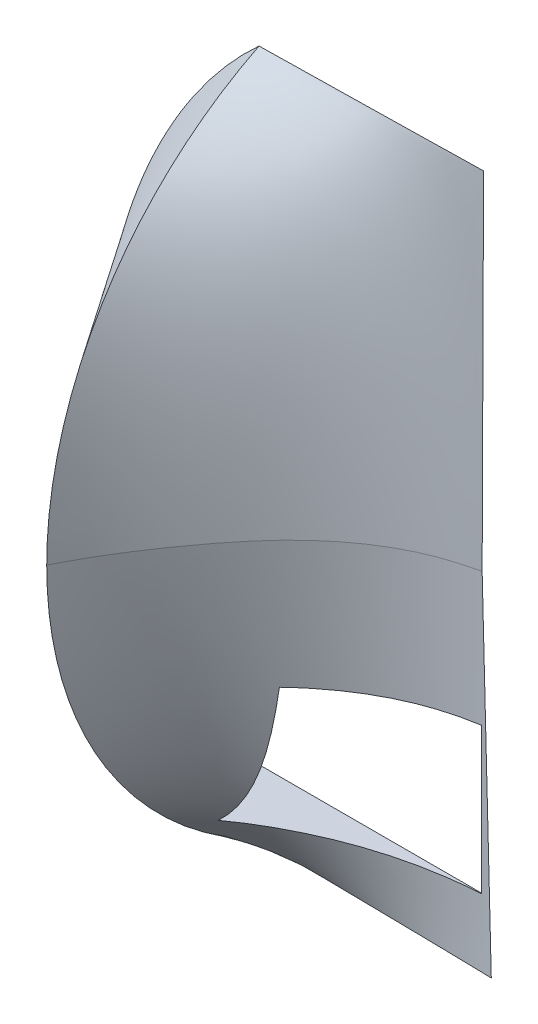
ISO-10303-21;
HEADER;
FILE_DESCRIPTION(('STEP AP214'),'2;1');
FILE_NAME('part.step','',(''),(''),'','','');
FILE_SCHEMA(('AUTOMOTIVE_DESIGN { 1 0 10303 214 1 1 1 1 }'));
ENDSEC;
DATA;
#1=APPLICATION_CONTEXT('core data for automotive mechanical design processes');
#2=APPLICATION_PROTOCOL_DEFINITION('international standard','automotive_design',2000,#1);
#3=PRODUCT_CONTEXT('',#1,'mechanical');
#4=PRODUCT('Part','Part','',(#3));
#5=PRODUCT_RELATED_PRODUCT_CATEGORY('part','',(#4));
#6=PRODUCT_DEFINITION_FORMATION('','',#4);
#7=PRODUCT_DEFINITION_CONTEXT('part definition',#1,'design');
#8=PRODUCT_DEFINITION('design','',#6,#7);
#9=PRODUCT_DEFINITION_SHAPE('','',#8);
#10=(LENGTH_UNIT() NAMED_UNIT(*) SI_UNIT(.MILLI.,.METRE.));
#11=(NAMED_UNIT(*) PLANE_ANGLE_UNIT() SI_UNIT($,.RADIAN.));
#12=(NAMED_UNIT(*) SI_UNIT($,.STERADIAN.) SOLID_ANGLE_UNIT());
#13=UNCERTAINTY_MEASURE_WITH_UNIT(LENGTH_MEASURE(1.E-05),#10,'distance_accuracy_value','');
#14=(GEOMETRIC_REPRESENTATION_CONTEXT(3) GLOBAL_UNCERTAINTY_ASSIGNED_CONTEXT((#13)) GLOBAL_UNIT_ASSIGNED_CONTEXT((#10,
#11,#12)) REPRESENTATION_CONTEXT('',''));
#15=CARTESIAN_POINT('',(0.,0.,0.));
#16=DIRECTION('',(0.,0.,1.));
#17=DIRECTION('',(1.,0.,0.));
#18=AXIS2_PLACEMENT_3D('',#15,#16,#17);
#19=CARTESIAN_POINT('',(-7.0169426798972,164.309273303935,-23.639993355338));
#20=DIRECTION('',(-1.,0.,0.));
#21=DIRECTION('',(0.,-1.,0.));
#22=AXIS2_PLACEMENT_3D('',#19,#20,#21);
#23=CIRCLE('',#22,22.3714261491486);
#24=DIRECTION('',(0.590839697824268,0.140305600523294,0.794495305169719));
#25=VECTOR('',#24,1.);
#26=SURFACE_OF_LINEAR_EXTRUSION('',#23,#25);
#27=CARTESIAN_POINT('',(18.,190.262014090211,20.));
#28=CARTESIAN_POINT('',(17.7579578460864,190.041886930324,20.));
#29=CARTESIAN_POINT('',(17.5208670592247,189.816363579263,20.));
#30=CARTESIAN_POINT('',(17.0565925500612,189.355427255375,20.));
#31=CARTESIAN_POINT('',(16.8294067973651,189.120016328974,20.));
#32=CARTESIAN_POINT('',(16.3850835924438,188.640371612688,20.));
#33=CARTESIAN_POINT('',(16.1679357032237,188.396147479567,20.));
#34=CARTESIAN_POINT('',(15.7433638030594,187.899387411779,20.));
#35=CARTESIAN_POINT('',(15.5359404313314,187.646850932573,20.));
#36=CARTESIAN_POINT('',(14.9285144647548,186.878268183608,20.));
#37=CARTESIAN_POINT('',(14.5429011242624,186.350754331616,20.));
#38=CARTESIAN_POINT('',(13.8095645558032,185.269948073454,20.));
#39=CARTESIAN_POINT('',(13.4618531474176,184.716647702203,20.));
#40=CARTESIAN_POINT('',(12.804131055731,183.588713666381,20.));
#41=CARTESIAN_POINT('',(12.4940897753426,183.014097817016,20.));
#42=CARTESIAN_POINT('',(11.9109937855409,181.846394301616,20.));
#43=CARTESIAN_POINT('',(11.6379414521499,181.253305451956,20.));
#44=CARTESIAN_POINT('',(11.1287421225466,180.051738543957,20.));
#45=CARTESIAN_POINT('',(10.8925832895889,179.44326549451,20.));
#46=CARTESIAN_POINT('',(10.457118167544,178.213305578093,20.));
#47=CARTESIAN_POINT('',(10.2578109368784,177.591819044076,20.));
#48=CARTESIAN_POINT('',(9.89636288856868,176.338231724245,20.));
#49=CARTESIAN_POINT('',(9.73421632663307,175.70613259516,20.));
#50=CARTESIAN_POINT('',(9.44759871395448,174.433351280502,20.));
#51=CARTESIAN_POINT('',(9.32313452606818,173.792667553631,20.));
#52=CARTESIAN_POINT('',(9.08073672715209,172.308904515552,20.));
#53=CARTESIAN_POINT('',(8.97632192378528,171.463577064794,20.));
#54=CARTESIAN_POINT('',(8.83584583289237,169.767230596266,20.));
#55=CARTESIAN_POINT('',(8.79977969381085,168.916211986773,20.));
#56=CARTESIAN_POINT('',(8.79978448087299,167.41238777615,20.));
#57=CARTESIAN_POINT('',(8.82101582777535,166.759562378267,20.));
#58=CARTESIAN_POINT('',(8.90812461957761,165.45688036515,20.));
#59=CARTESIAN_POINT('',(8.97399718461456,164.807023433241,20.));
#60=CARTESIAN_POINT('',(9.15308603647443,163.513155072062,20.));
#61=CARTESIAN_POINT('',(9.26634829179266,162.869149940498,20.));
#62=CARTESIAN_POINT('',(9.54331153874616,161.591960654778,20.));
#63=CARTESIAN_POINT('',(9.70701005629492,160.958775971446,20.));
#64=CARTESIAN_POINT('',(10.0632917648379,159.790831285893,20.));
#65=CARTESIAN_POINT('',(10.2492657824912,159.254058845098,20.));
#66=CARTESIAN_POINT('',(10.6643705761642,158.197438089685,20.));
#67=CARTESIAN_POINT('',(10.8934910835431,157.677585782619,20.));
#68=CARTESIAN_POINT('',(11.3564285459393,156.743022393248,20.));
#69=CARTESIAN_POINT('',(11.5834436291234,156.324943937405,20.));
#70=CARTESIAN_POINT('',(12.0708018016585,155.508619252455,20.));
#71=CARTESIAN_POINT('',(12.3311409797001,155.110370703485,20.));
#72=CARTESIAN_POINT('',(12.8472825870951,154.392518202587,20.));
#73=CARTESIAN_POINT('',(13.0986131784487,154.06971176386,20.));
#74=CARTESIAN_POINT('',(13.4947180576225,153.601901235782,20.));
#75=CARTESIAN_POINT('',(13.6299108006218,153.448724675588,20.));
#76=CARTESIAN_POINT('',(13.9067224848923,153.148215223779,20.));
#77=CARTESIAN_POINT('',(14.0483431556291,153.000883925084,20.));
#78=CARTESIAN_POINT('',(14.4663114310243,152.584810334125,20.));
#79=CARTESIAN_POINT('',(14.7508326185575,152.324179802817,20.));
#80=CARTESIAN_POINT('',(15.3418720232683,151.828995968898,20.));
#81=CARTESIAN_POINT('',(15.6483919450039,151.594444690619,20.));
#82=CARTESIAN_POINT('',(16.1248846114703,151.263886511147,20.));
#83=CARTESIAN_POINT('',(16.2872644814334,151.156815237988,20.));
#84=CARTESIAN_POINT('',(16.6170046677287,150.950614544805,20.));
#85=CARTESIAN_POINT('',(16.7843648688276,150.851484941226,20.));
#86=CARTESIAN_POINT('',(17.1239234189894,150.661495867161,20.));
#87=CARTESIAN_POINT('',(17.2961261781209,150.570644277056,20.));
#88=CARTESIAN_POINT('',(17.6448886184522,150.397671278094,20.));
#89=CARTESIAN_POINT('',(17.8214488716706,150.315551023012,20.));
#90=CARTESIAN_POINT('',(17.9999999999667,150.237985909804,20.));
#91=B_SPLINE_CURVE_WITH_KNOTS('',3,(#27,#28,#29,#30,#31,#32,#33,#34,#35,#36,#37,#38,#39,#40,#41,
#42,#43,#44,#45,#46,#47,#48,#49,#50,#51,#52,#53,#54,#55,#56,#57,#58,#59,#60,#61,#62,#63,#64,#65,
#66,#67,#68,#69,#70,#71,#72,#73,#74,#75,#76,#77,#78,#79,#80,#81,#82,#83,#84,#85,#86,#87,#88,#89,
#90),.UNSPECIFIED.,.F.,.F.,(4,2,2,2,2,2,2,2,2,2,2,2,2,2,2,2,2,2,2,2,2,2,2,2,2,2,2,2,2,2,2,4),
(0.,0.981380587919026,1.96255905143303,2.9426932538982,3.92289179290148,5.88127894360083,
7.84027507357073,9.79766924293357,11.7551890879249,13.7120795954659,15.6689200964836,
17.6254579050119,19.5823518315595,22.1348797603662,24.6872264977078,26.6453543942538,
28.6032682765956,30.5630857750927,32.5228071525445,34.2253669973386,35.9275221526508,
37.3533247865063,38.7789602245089,40.0049163165518,40.6176653866214,41.2305803086301,
42.3866581674218,43.5428257010903,44.1261457360998,44.7094522849381,45.2933084430373,
45.8772416573557),.UNSPECIFIED.);
#92=CARTESIAN_POINT('',(18.,150.237985909812,20.0000000000447));
#93=VERTEX_POINT('',#92);
#94=CARTESIAN_POINT('',(13.1619546469406,154.,20.));
#95=VERTEX_POINT('',#94);
#96=EDGE_CURVE('E106',#93,#95,#91,.F.);
#97=ORIENTED_EDGE('',*,*,#96,.F.);
#98=CARTESIAN_POINT('',(18.,170.25,32.3714261491486));
#99=CARTESIAN_POINT('',(18.,164.368180059982,32.3714261491486));
#100=CARTESIAN_POINT('',(18.,157.713911716258,30.2783714946459));
#101=CARTESIAN_POINT('',(18.,152.867152195783,25.2614912760521));
#102=CARTESIAN_POINT('',(18.,150.237985909811,20.0000000000447));
#103=(BOUNDED_CURVE() B_SPLINE_CURVE(4,(#98,#99,#100,#101,#102),.UNSPECIFIED.,.F.,
.F.) B_SPLINE_CURVE_WITH_KNOTS((5,5),(0.,1.),
.UNSPECIFIED.) CURVE() GEOMETRIC_REPRESENTATION_ITEM() RATIONAL_B_SPLINE_CURVE((0.540368887033077,
0.540368887033077,0.532326741111923,0.540368887033077,0.540368887033077)) REPRESENTATION_ITEM(''));
#104=CARTESIAN_POINT('',(18.,170.25,32.3714261491486));
#105=VERTEX_POINT('',#104);
#106=EDGE_CURVE('E311',#105,#93,#103,.T.);
#107=ORIENTED_EDGE('',*,*,#106,.F.);
#108=CARTESIAN_POINT('',(18.,190.262014090189,20.0000000000448));
#109=CARTESIAN_POINT('',(18.,187.632847804217,25.2614912760521));
#110=CARTESIAN_POINT('',(18.,182.786088283742,30.2783714946459));
#111=CARTESIAN_POINT('',(18.,176.131819940018,32.3714261491486));
#112=CARTESIAN_POINT('',(18.,170.25,32.3714261491486));
#113=(BOUNDED_CURVE() B_SPLINE_CURVE(4,(#108,#109,#110,#111,#112),.UNSPECIFIED.,.F.,
.F.) B_SPLINE_CURVE_WITH_KNOTS((5,5),(0.,1.),
.UNSPECIFIED.) CURVE() GEOMETRIC_REPRESENTATION_ITEM() RATIONAL_B_SPLINE_CURVE((0.540368887033077,
0.540368887033077,0.532326741111923,0.540368887033077,0.540368887033077)) REPRESENTATION_ITEM(''));
#114=CARTESIAN_POINT('',(18.,190.262014090189,20.0000000000447));
#115=VERTEX_POINT('',#114);
#116=EDGE_CURVE('E260',#115,#105,#113,.T.);
#117=ORIENTED_EDGE('',*,*,#116,.F.);
#118=CARTESIAN_POINT('',(18.,190.262014090211,20.));
#119=CARTESIAN_POINT('',(17.7579578460864,190.041886930324,20.));
#120=CARTESIAN_POINT('',(17.5208670592247,189.816363579263,20.));
#121=CARTESIAN_POINT('',(17.0565925500612,189.355427255375,20.));
#122=CARTESIAN_POINT('',(16.8294067973651,189.120016328974,20.));
#123=CARTESIAN_POINT('',(16.3850835924438,188.640371612688,20.));
#124=CARTESIAN_POINT('',(16.1679357032237,188.396147479567,20.));
#125=CARTESIAN_POINT('',(15.7433638030594,187.899387411779,20.));
#126=CARTESIAN_POINT('',(15.5359404313314,187.646850932573,20.));
#127=CARTESIAN_POINT('',(14.9285144647548,186.878268183608,20.));
#128=CARTESIAN_POINT('',(14.5429011242624,186.350754331616,20.));
#129=CARTESIAN_POINT('',(13.8095645558032,185.269948073454,20.));
#130=CARTESIAN_POINT('',(13.4618531474176,184.716647702203,20.));
#131=CARTESIAN_POINT('',(12.804131055731,183.588713666381,20.));
#132=CARTESIAN_POINT('',(12.4940897753426,183.014097817016,20.));
#133=CARTESIAN_POINT('',(11.9109937855409,181.846394301616,20.));
#134=CARTESIAN_POINT('',(11.6379414521499,181.253305451956,20.));
#135=CARTESIAN_POINT('',(11.1287421225466,180.051738543957,20.));
#136=CARTESIAN_POINT('',(10.8925832895889,179.44326549451,20.));
#137=CARTESIAN_POINT('',(10.457118167544,178.213305578093,20.));
#138=CARTESIAN_POINT('',(10.2578109368784,177.591819044076,20.));
#139=CARTESIAN_POINT('',(9.89636288856868,176.338231724245,20.));
#140=CARTESIAN_POINT('',(9.73421632663307,175.70613259516,20.));
#141=CARTESIAN_POINT('',(9.44759871395448,174.433351280502,20.));
#142=CARTESIAN_POINT('',(9.32313452606818,173.792667553631,20.));
#143=CARTESIAN_POINT('',(9.08073672715209,172.308904515552,20.));
#144=CARTESIAN_POINT('',(8.97632192378528,171.463577064794,20.));
#145=CARTESIAN_POINT('',(8.83584583289237,169.767230596266,20.));
#146=CARTESIAN_POINT('',(8.79977969381085,168.916211986773,20.));
#147=CARTESIAN_POINT('',(8.79978448087299,167.41238777615,20.));
#148=CARTESIAN_POINT('',(8.82101582777535,166.759562378267,20.));
#149=CARTESIAN_POINT('',(8.90812461957761,165.45688036515,20.));
#150=CARTESIAN_POINT('',(8.97399718461456,164.807023433241,20.));
#151=CARTESIAN_POINT('',(9.15308603647443,163.513155072062,20.));
#152=CARTESIAN_POINT('',(9.26634829179266,162.869149940498,20.));
#153=CARTESIAN_POINT('',(9.54331153874616,161.591960654778,20.));
#154=CARTESIAN_POINT('',(9.70701005629492,160.958775971446,20.));
#155=CARTESIAN_POINT('',(10.0632917648379,159.790831285893,20.));
#156=CARTESIAN_POINT('',(10.2492657824912,159.254058845098,20.));
#157=CARTESIAN_POINT('',(10.6643705761642,158.197438089685,20.));
#158=CARTESIAN_POINT('',(10.8934910835431,157.677585782619,20.));
#159=CARTESIAN_POINT('',(11.3564285459393,156.743022393248,20.));
#160=CARTESIAN_POINT('',(11.5834436291234,156.324943937405,20.));
#161=CARTESIAN_POINT('',(12.0708018016585,155.508619252455,20.));
#162=CARTESIAN_POINT('',(12.3311409797001,155.110370703485,20.));
#163=CARTESIAN_POINT('',(12.8472825870951,154.392518202587,20.));
#164=CARTESIAN_POINT('',(13.0986131784487,154.06971176386,20.));
#165=CARTESIAN_POINT('',(13.4947180576225,153.601901235782,20.));
#166=CARTESIAN_POINT('',(13.6299108006218,153.448724675588,20.));
#167=CARTESIAN_POINT('',(13.9067224848923,153.148215223779,20.));
#168=CARTESIAN_POINT('',(14.0483431556291,153.000883925084,20.));
#169=CARTESIAN_POINT('',(14.4663114310243,152.584810334125,20.));
#170=CARTESIAN_POINT('',(14.7508326185575,152.324179802817,20.));
#171=CARTESIAN_POINT('',(15.3418720232683,151.828995968898,20.));
#172=CARTESIAN_POINT('',(15.6483919450039,151.594444690619,20.));
#173=CARTESIAN_POINT('',(16.1248846114703,151.263886511147,20.));
#174=CARTESIAN_POINT('',(16.2872644814334,151.156815237988,20.));
#175=CARTESIAN_POINT('',(16.6170046677287,150.950614544805,20.));
#176=CARTESIAN_POINT('',(16.7843648688276,150.851484941226,20.));
#177=CARTESIAN_POINT('',(17.1239234189894,150.661495867161,20.));
#178=CARTESIAN_POINT('',(17.2961261781209,150.570644277056,20.));
#179=CARTESIAN_POINT('',(17.6448886184522,150.397671278094,20.));
#180=CARTESIAN_POINT('',(17.8214488716706,150.315551023012,20.));
#181=CARTESIAN_POINT('',(17.9999999999667,150.237985909804,20.));
#182=B_SPLINE_CURVE_WITH_KNOTS('',3,(#118,#119,#120,#121,#122,#123,#124,#125,#126,#127,#128,
#129,#130,#131,#132,#133,#134,#135,#136,#137,#138,#139,#140,#141,#142,#143,#144,#145,#146,#147,
#148,#149,#150,#151,#152,#153,#154,#155,#156,#157,#158,#159,#160,#161,#162,#163,#164,#165,#166,
#167,#168,#169,#170,#171,#172,#173,#174,#175,#176,#177,#178,#179,#180,#181),.UNSPECIFIED.,.F.,
.F.,(4,2,2,2,2,2,2,2,2,2,2,2,2,2,2,2,2,2,2,2,2,2,2,2,2,2,2,2,2,2,2,4),(0.,0.981380587919026,
1.96255905143303,2.9426932538982,3.92289179290148,5.88127894360083,7.84027507357073,
9.79766924293357,11.7551890879249,13.7120795954659,15.6689200964836,17.6254579050119,
19.5823518315595,22.1348797603662,24.6872264977078,26.6453543942538,28.6032682765956,
30.5630857750927,32.5228071525445,34.2253669973386,35.9275221526508,37.3533247865063,
38.7789602245089,40.0049163165518,40.6176653866214,41.2305803086301,42.3866581674218,
43.5428257010903,44.1261457360998,44.7094522849381,45.2933084430373,45.8772416573557),.UNSPECIFIED.);
#183=CARTESIAN_POINT('',(9.34795839743124,162.5,20.));
#184=VERTEX_POINT('',#183);
#185=EDGE_CURVE('E117',#184,#115,#182,.F.);
#186=ORIENTED_EDGE('',*,*,#185,.F.);
#187=CARTESIAN_POINT('',(12.4784145846166,162.5,23.9999999999998));
#188=CARTESIAN_POINT('',(11.9555513871421,162.5,23.3342102520675));
#189=CARTESIAN_POINT('',(11.4332484394728,162.5,22.6679820447681));
#190=CARTESIAN_POINT('',(10.3897630437444,162.5,21.3346487114348));
#191=CARTESIAN_POINT('',(9.86858059568525,162.5,20.667543585401));
#192=CARTESIAN_POINT('',(9.34795839743124,162.5,20.));
#193=B_SPLINE_CURVE_WITH_KNOTS('',3,(#187,#188,#189,#190,#191,#192),.UNSPECIFIED.,.F.,.F.,(4,2,
4),(0.,2.53967390428562,5.07934780857124),.UNSPECIFIED.);
#194=CARTESIAN_POINT('',(12.4784145846166,162.5,24.));
#195=VERTEX_POINT('',#194);
#196=EDGE_CURVE('E135',#184,#195,#193,.F.);
#197=ORIENTED_EDGE('',*,*,#196,.T.);
#198=CARTESIAN_POINT('',(16.747460888285,154.,24.));
#199=CARTESIAN_POINT('',(16.4438931234237,154.329286249411,24.));
#200=CARTESIAN_POINT('',(16.1559732601038,154.672343656248,24.));
#201=CARTESIAN_POINT('',(15.6109817010651,155.381596733695,24.));
#202=CARTESIAN_POINT('',(15.3538764369729,155.747766549947,24.));
#203=CARTESIAN_POINT('',(14.6234122397177,156.881313748602,24.));
#204=CARTESIAN_POINT('',(14.1955827612318,157.678510870583,24.));
#205=CARTESIAN_POINT('',(13.638620575577,158.911622572493,24.));
#206=CARTESIAN_POINT('',(13.466944816104,159.329393277284,24.));
#207=CARTESIAN_POINT('',(13.1505350358702,160.175101948745,24.));
#208=CARTESIAN_POINT('',(13.0057974105888,160.603038546492,24.));
#209=CARTESIAN_POINT('',(12.8000672275013,161.276848398235,24.));
#210=CARTESIAN_POINT('',(12.7302251803581,161.520083008899,24.));
#211=CARTESIAN_POINT('',(12.5984538623241,162.008572805307,24.));
#212=CARTESIAN_POINT('',(12.5365211165436,162.253827052976,24.));
#213=CARTESIAN_POINT('',(12.478414584617,162.5,24.));
#214=B_SPLINE_CURVE_WITH_KNOTS('',3,(#198,#199,#200,#201,#202,#203,#204,#205,#206,#207,#208,
#209,#210,#211,#212,#213),.UNSPECIFIED.,.F.,.F.,(4,2,2,2,2,2,2,4),(0.,1.34230950090254,
2.6831431822856,5.38558364420139,6.73999814160167,8.09423127788216,8.85331284314478,
9.61205975609087),.UNSPECIFIED.);
#215=CARTESIAN_POINT('',(16.747460888285,154.,24.));
#216=VERTEX_POINT('',#215);
#217=EDGE_CURVE('E108',#195,#216,#214,.F.);
#218=ORIENTED_EDGE('',*,*,#217,.T.);
#219=CARTESIAN_POINT('',(13.1619546469406,154.,20.));
#220=CARTESIAN_POINT('',(13.3599849347014,154.,20.2232645804158));
#221=CARTESIAN_POINT('',(13.5581982955539,154.,20.446366816839));
#222=CARTESIAN_POINT('',(13.9550007468272,154.,20.8922343764498));
#223=CARTESIAN_POINT('',(14.1535898348656,154.,21.1149997017577));
#224=CARTESIAN_POINT('',(14.551155156296,154.,21.5601832854957));
#225=CARTESIAN_POINT('',(14.7501313883804,154.,21.7826015450937));
#226=CARTESIAN_POINT('',(15.1484833632272,154.,22.2270801334231));
#227=CARTESIAN_POINT('',(15.3478591060986,154.,22.449140462057));
#228=CARTESIAN_POINT('',(15.7470228980129,154.,22.8928915069368));
#229=CARTESIAN_POINT('',(15.9468109483317,154.,23.1145822220351));
#230=CARTESIAN_POINT('',(16.3468132757973,154.,23.5575814646254));
#231=CARTESIAN_POINT('',(16.5470275557743,154.,23.7788899895619));
#232=CARTESIAN_POINT('',(16.7474608882849,154.,24.));
#233=B_SPLINE_CURVE_WITH_KNOTS('',3,(#219,#220,#221,#222,#223,#224,#225,#226,#227,#228,#229,
#230,#231,#232),.UNSPECIFIED.,.F.,.F.,(4,2,2,2,2,2,4),(0.,0.895303023388757,1.79060038874917,
2.68589473514372,3.58118932558843,4.47648669100672,5.37179001997255),.UNSPECIFIED.);
#234=EDGE_CURVE('E92',#216,#95,#233,.F.);
#235=ORIENTED_EDGE('',*,*,#234,.T.);
#236=EDGE_LOOP('',(#97,#107,#117,#186,#197,#218,#235));
#237=FACE_BOUND('',#236,.T.);
#238=ADVANCED_FACE('F17',(#237),#26,.F.);
#239=CARTESIAN_POINT('',(18.,150.237985909811,20.0000000000447));
#240=CARTESIAN_POINT('',(19.6173208757204,150.203502449855,20.0000000000321));
#241=CARTESIAN_POINT('',(22.2377388092975,150.159738475768,20.0000000000178));
#242=CARTESIAN_POINT('',(25.9567173238859,150.107540844688,20.0000000000056));
#243=CARTESIAN_POINT('',(28.8502284043128,150.061332950591,20.000000000001));
#244=CARTESIAN_POINT('',(30.7407644869514,150.024176434347,20.0000000000001));
#245=CARTESIAN_POINT('',(31.5328382853332,150.,20.));
#246=CARTESIAN_POINT('',(18.,152.867152195783,25.2614912760521));
#247=CARTESIAN_POINT('',(19.3754441031544,153.185251650308,24.1435952749095));
#248=CARTESIAN_POINT('',(21.7671177522327,153.588961031641,22.7010115136992));
#249=CARTESIAN_POINT('',(25.3914622492416,154.07046833965,21.1251786149187));
#250=CARTESIAN_POINT('',(28.4558460182346,154.496722141505,20.3063955780542));
#251=CARTESIAN_POINT('',(30.5256166740133,154.839479729176,20.0615885461734));
#252=CARTESIAN_POINT('',(31.3996287139999,155.0625,20.));
#253=CARTESIAN_POINT('',(18.,157.713911716258,30.2783714946459));
#254=CARTESIAN_POINT('',(19.1411064914858,158.06327133317,28.1120015393569));
#255=CARTESIAN_POINT('',(21.3078714178337,158.506653906765,25.3045249811574));
#256=CARTESIAN_POINT('',(24.8342945905822,159.035479738666,22.2198203371469));
#257=CARTESIAN_POINT('',(28.0624952237772,159.503622210477,20.6075018323066));
#258=CARTESIAN_POINT('',(30.3093466794987,159.880063156285,20.1227151644111));
#259=CARTESIAN_POINT('',(31.2664191426665,160.125,20.));
#260=CARTESIAN_POINT('',(18.,164.368180059982,32.3714261491486));
#261=CARTESIAN_POINT('',(19.0249487631942,164.486897114975,29.9863810142593));
#262=CARTESIAN_POINT('',(21.0423059978896,164.637564424029,26.7426484494471));
#263=CARTESIAN_POINT('',(24.4467523708966,164.817266491263,22.9494558800798));
#264=CARTESIAN_POINT('',(27.7382131604363,164.976347543794,20.8453850241639));
#265=CARTESIAN_POINT('',(30.1059246430104,165.104267195356,20.1783203776836));
#266=CARTESIAN_POINT('',(31.1332095713333,165.1875,20.));
#267=CARTESIAN_POINT('',(18.,170.25,32.3714261491486));
#268=CARTESIAN_POINT('',(18.9957394058888,170.25,30.3617269721351));
#269=CARTESIAN_POINT('',(20.9202181961083,170.25,27.346513885374));
#270=CARTESIAN_POINT('',(24.1867421707447,170.25,23.417797489517));
#271=CARTESIAN_POINT('',(27.4681215428217,170.25,21.0380092489188));
#272=CARTESIAN_POINT('',(29.9138970257161,170.25,20.2299730287704));
#273=CARTESIAN_POINT('',(31.,170.25,20.));
#274=(BOUNDED_SURFACE() B_SPLINE_SURFACE(4,3,((#239,#240,#241,#242,#243,#244,#245),(#246,#247,
#248,#249,#250,#251,#252),(#253,#254,#255,#256,#257,#258,#259),(#260,#261,#262,#263,#264,#265,
#266),(#267,#268,#269,#270,#271,#272,#273)),.UNSPECIFIED.,.F.,.F.,
.F.) B_SPLINE_SURFACE_WITH_KNOTS((5,5),(4,1,1,1,4),(0.,1.),(0.,0.358592466759511,
0.580965414241703,0.824466809217814,1.),
.UNSPECIFIED.) GEOMETRIC_REPRESENTATION_ITEM() RATIONAL_B_SPLINE_SURFACE(((0.540368887033077,
0.60696808650247,0.691491090967061,0.792302333475813,0.881545372312903,0.95330714563942,1.),
(0.540368887033077,0.60696808650247,0.691491090967061,0.792302333475813,0.881545372312903,
0.95330714563942,1.),(0.532326741111923,0.600091223925404,0.686093123783326,0.788668256289679,
0.879472776759599,0.952490162764133,1.),(0.540368887033077,0.60696808650247,0.691491090967061,
0.792302333475813,0.881545372312903,0.95330714563942,1.),(0.540368887033077,0.60696808650247,
0.691491090967061,0.792302333475813,0.881545372312903,0.95330714563942,1.))) REPRESENTATION_ITEM('') SURFACE());
#275=CARTESIAN_POINT('',(18.,150.237985909811,20.0000000000447));
#276=CARTESIAN_POINT('',(19.6173208757204,150.203502449855,20.0000000000321));
#277=CARTESIAN_POINT('',(22.2377388092975,150.159738475768,20.0000000000178));
#278=CARTESIAN_POINT('',(25.9567173238859,150.107540844688,20.0000000000056));
#279=CARTESIAN_POINT('',(28.8502284043128,150.061332950591,20.000000000001));
#280=CARTESIAN_POINT('',(30.7407644869514,150.024176434347,20.0000000000001));
#281=CARTESIAN_POINT('',(31.5328382853332,150.,20.));
#282=(BOUNDED_CURVE() B_SPLINE_CURVE(3,(#275,#276,#277,#278,#279,#280,#281),.UNSPECIFIED.,.F.,
.F.) B_SPLINE_CURVE_WITH_KNOTS((4,1,1,1,4),(0.,0.358592466759511,0.580965414241703,
0.824466809217814,1.),
.UNSPECIFIED.) CURVE() GEOMETRIC_REPRESENTATION_ITEM() RATIONAL_B_SPLINE_CURVE((0.540368887033077,
0.60696808650247,0.691491090967061,0.792302333475813,0.881545372312903,0.95330714563942,1.)) REPRESENTATION_ITEM(''));
#283=CARTESIAN_POINT('',(31.5328382853332,150.,20.));
#284=VERTEX_POINT('',#283);
#285=EDGE_CURVE('E113',#93,#284,#282,.T.);
#286=CARTESIAN_POINT('',(31.5328382853332,150.,20.));
#287=CARTESIAN_POINT('',(31.3996287139999,155.0625,20.));
#288=CARTESIAN_POINT('',(31.2664191426665,160.125,20.));
#289=CARTESIAN_POINT('',(31.1332095713333,165.1875,20.));
#290=CARTESIAN_POINT('',(31.,170.25,20.));
#291=(BOUNDED_CURVE() B_SPLINE_CURVE(4,(#286,#287,#288,#289,#290),.UNSPECIFIED.,.F.,
.F.) B_SPLINE_CURVE_WITH_KNOTS((5,5),(0.,1.),
.UNSPECIFIED.) CURVE() GEOMETRIC_REPRESENTATION_ITEM() RATIONAL_B_SPLINE_CURVE((1.,1.,1.,1.,1.)) REPRESENTATION_ITEM(''));
#292=CARTESIAN_POINT('',(31.,170.25,20.));
#293=VERTEX_POINT('',#292);
#294=EDGE_CURVE('E279',#284,#293,#291,.T.);
#295=CARTESIAN_POINT('',(31.,170.25,20.));
#296=CARTESIAN_POINT('',(29.9138970257161,170.25,20.2299730287704));
#297=CARTESIAN_POINT('',(27.4681215428217,170.25,21.0380092489188));
#298=CARTESIAN_POINT('',(24.1867421707447,170.25,23.417797489517));
#299=CARTESIAN_POINT('',(20.9202181961083,170.25,27.346513885374));
#300=CARTESIAN_POINT('',(18.9957394058888,170.25,30.3617269721351));
#301=CARTESIAN_POINT('',(18.,170.25,32.3714261491486));
#302=(BOUNDED_CURVE() B_SPLINE_CURVE(3,(#295,#296,#297,#298,#299,#300,#301),.UNSPECIFIED.,.F.,
.F.) B_SPLINE_CURVE_WITH_KNOTS((4,1,1,1,4),(0.,0.175533190782186,0.419034585758297,
0.641407533240489,1.),
.UNSPECIFIED.) CURVE() GEOMETRIC_REPRESENTATION_ITEM() RATIONAL_B_SPLINE_CURVE((1.,
0.95330714563942,0.881545372312903,0.792302333475813,0.691491090967061,0.60696808650247,0.540368887033077)) REPRESENTATION_ITEM(''));
#303=EDGE_CURVE('E313',#293,#105,#302,.T.);
#304=CARTESIAN_POINT('',(19.6209782505229,154.,24.));
#305=CARTESIAN_POINT('',(19.9145568376288,154.,23.7843187774645));
#306=CARTESIAN_POINT('',(20.2153962781229,154.,23.5787856214878));
#307=CARTESIAN_POINT('',(20.8289449085669,154.,23.1864402585697));
#308=CARTESIAN_POINT('',(21.1416503657711,154.,22.999622230547));
#309=CARTESIAN_POINT('',(21.617820666829,154.,22.7321219701642));
#310=CARTESIAN_POINT('',(21.7777598168232,154.,22.6450613612903));
#311=CARTESIAN_POINT('',(22.0997714671291,154.,22.4749671774775));
#312=CARTESIAN_POINT('',(22.2618439728864,154.,22.3919336128202));
#313=CARTESIAN_POINT('',(22.5845042191623,154.,22.2313138863069));
#314=CARTESIAN_POINT('',(22.7450536840543,154.,22.1536507110605));
#315=CARTESIAN_POINT('',(23.0678900875166,154.,22.0020346632163));
#316=CARTESIAN_POINT('',(23.2301770031295,154.,21.928081741667));
#317=CARTESIAN_POINT('',(23.7196415754852,154.,21.7121256171934));
#318=CARTESIAN_POINT('',(24.0494467875503,154.,21.5760131872987));
#319=CARTESIAN_POINT('',(24.7154176533743,154.,21.3205710638626));
#320=CARTESIAN_POINT('',(25.0515820614939,154.,21.2012381213952));
#321=CARTESIAN_POINT('',(25.6900980418455,154.,20.9926411465457));
#322=CARTESIAN_POINT('',(25.9918362572347,154.,20.9014942159188));
#323=CARTESIAN_POINT('',(26.5989823691806,154.,20.7323827575828));
#324=CARTESIAN_POINT('',(26.9043902889138,154.,20.6544183131763));
#325=CARTESIAN_POINT('',(27.518266535005,154.,20.5114991965667));
#326=CARTESIAN_POINT('',(27.8267352045127,154.,20.4465460007919));
#327=CARTESIAN_POINT('',(28.4518069943143,154.,20.3285568178875));
#328=CARTESIAN_POINT('',(28.7684555600861,154.,20.2757611730919));
#329=CARTESIAN_POINT('',(29.4036517130142,154.,20.1835378771696));
#330=CARTESIAN_POINT('',(29.7221991834142,154.,20.1441094126006));
#331=CARTESIAN_POINT('',(30.3604008730163,154.,20.0770847072578));
#332=CARTESIAN_POINT('',(30.680054526989,154.,20.0494831272346));
#333=CARTESIAN_POINT('',(31.,154.,20.0270125510034));
#334=B_SPLINE_CURVE_WITH_KNOTS('',3,(#304,#305,#306,#307,#308,#309,#310,#311,#312,#313,#314,
#315,#316,#317,#318,#319,#320,#321,#322,#323,#324,#325,#326,#327,#328,#329,#330,#331,#332,#333),
.UNSPECIFIED.,.F.,.F.,(4,2,2,2,2,2,2,2,2,2,2,2,2,2,4),(0.,1.09244610416079,2.1845513561659,
2.7308069139999,3.27706386645264,3.81205901967833,4.34704711255935,5.416943784071,
6.48663301087281,7.43194307759259,8.37725911766979,9.3226823651133,10.285440268677,
11.2481395743302,12.2104038100968),.UNSPECIFIED.);
#335=CARTESIAN_POINT('',(31.,154.,20.0270125510034));
#336=VERTEX_POINT('',#335);
#337=CARTESIAN_POINT('',(19.6209782505229,154.,24.));
#338=VERTEX_POINT('',#337);
#339=EDGE_CURVE('E31',#336,#338,#334,.F.);
#340=CARTESIAN_POINT('',(19.6209782505229,154.,24.));
#341=CARTESIAN_POINT('',(19.7298814867216,154.100995591038,24.));
#342=CARTESIAN_POINT('',(19.8361614974653,154.204820767949,24.));
#343=CARTESIAN_POINT('',(20.0429794298442,154.417627422584,24.));
#344=CARTESIAN_POINT('',(20.1435286621845,154.526597908225,24.));
#345=CARTESIAN_POINT('',(20.3387257901737,154.749480512597,24.));
#346=CARTESIAN_POINT('',(20.4333803123623,154.863386829076,24.));
#347=CARTESIAN_POINT('',(20.6167313982654,155.09583347742,24.));
#348=CARTESIAN_POINT('',(20.7054299046286,155.214372278174,24.));
#349=CARTESIAN_POINT('',(20.8748842299879,155.452907657248,24.));
#350=CARTESIAN_POINT('',(20.955775860674,155.572807907665,24.));
#351=CARTESIAN_POINT('',(21.1119437352137,155.816255071489,24.));
#352=CARTESIAN_POINT('',(21.1872183307766,155.939803040572,24.));
#353=CARTESIAN_POINT('',(21.3322856891655,156.190101697347,24.));
#354=CARTESIAN_POINT('',(21.4020774209801,156.316852981504,24.));
#355=CARTESIAN_POINT('',(21.5363626355027,156.573082822949,24.));
#356=CARTESIAN_POINT('',(21.6008574383856,156.702560690511,24.));
#357=CARTESIAN_POINT('',(21.7452269654585,157.006868290666,24.));
#358=CARTESIAN_POINT('',(21.8231839988447,157.182608827641,24.));
#359=CARTESIAN_POINT('',(21.9709723124529,157.537482268972,24.));
#360=CARTESIAN_POINT('',(22.04080240411,157.71661566509,24.));
#361=CARTESIAN_POINT('',(22.1731387449344,158.077761318372,24.));
#362=CARTESIAN_POINT('',(22.2356375168944,158.259776303448,24.));
#363=CARTESIAN_POINT('',(22.3540957793983,158.626167189249,24.));
#364=CARTESIAN_POINT('',(22.4100467916874,158.810545815309,24.));
#365=CARTESIAN_POINT('',(22.5161961189363,159.181150348121,24.));
#366=CARTESIAN_POINT('',(22.5663883729938,159.367377981005,24.));
#367=CARTESIAN_POINT('',(22.6636657890011,159.748989229648,24.));
#368=CARTESIAN_POINT('',(22.7105315008068,159.944428524723,24.));
#369=CARTESIAN_POINT('',(22.7993920898524,160.336298627937,24.));
#370=CARTESIAN_POINT('',(22.8413894771745,160.532728870139,24.));
#371=CARTESIAN_POINT('',(22.9210645394939,160.926072934701,24.));
#372=CARTESIAN_POINT('',(22.9587502313687,161.122985140646,24.));
#373=CARTESIAN_POINT('',(23.0302828895238,161.516795923597,24.));
#374=CARTESIAN_POINT('',(23.0641427190301,161.713692178173,24.));
#375=CARTESIAN_POINT('',(23.1284249093129,162.106993867981,24.));
#376=CARTESIAN_POINT('',(23.1588642473818,162.303396522295,24.));
#377=CARTESIAN_POINT('',(23.1878919514068,162.5,24.));
#378=B_SPLINE_CURVE_WITH_KNOTS('',3,(#340,#341,#342,#343,#344,#345,#346,#347,#348,#349,#350,
#351,#352,#353,#354,#355,#356,#357,#358,#359,#360,#361,#362,#363,#364,#365,#366,#367,#368,#369,
#370,#371,#372,#373,#374,#375,#376,#377),.UNSPECIFIED.,.F.,.F.,(4,2,2,2,2,2,2,2,2,2,2,2,2,2,2,2,
2,2,4),(0.,0.44552985101158,0.890147535850482,1.33425602903607,1.77821895846659,
2.21196483187433,2.64583748933589,3.07979153897883,3.51363710220027,4.09016497516703,
4.66677705964302,5.24397220921867,5.82190664905475,6.40044387183951,7.00331228344946,
7.60586846360445,8.20728543028079,8.80661604872733,9.40282664641651),.UNSPECIFIED.);
#379=CARTESIAN_POINT('',(23.1878919514068,162.5,24.));
#380=VERTEX_POINT('',#379);
#381=EDGE_CURVE('E124',#380,#338,#378,.F.);
#382=CARTESIAN_POINT('',(31.,162.5,20.0316218194152));
#383=CARTESIAN_POINT('',(30.737187592199,162.5,20.0740465185971));
#384=CARTESIAN_POINT('',(30.4753438442012,162.5,20.1228738203429));
#385=CARTESIAN_POINT('',(29.9546553633085,162.5,20.2343825723238));
#386=CARTESIAN_POINT('',(29.6958104036626,162.5,20.2970629677765));
#387=CARTESIAN_POINT('',(29.1822143048198,162.5,20.4373129351213));
#388=CARTESIAN_POINT('',(28.9274620162719,162.5,20.5148782447517));
#389=CARTESIAN_POINT('',(28.5523296870158,162.5,20.6417716233871));
#390=CARTESIAN_POINT('',(28.4299363770046,162.5,20.6852224474634));
#391=CARTESIAN_POINT('',(28.1865026885732,162.5,20.7757621759946));
#392=CARTESIAN_POINT('',(28.0654623128412,162.5,20.8228510876766));
#393=CARTESIAN_POINT('',(27.704506771916,162.5,20.969366394274));
#394=CARTESIAN_POINT('',(27.4667086521332,162.5,21.0740578441277));
#395=CARTESIAN_POINT('',(26.9973820805573,162.5,21.2965375669008));
#396=CARTESIAN_POINT('',(26.7658528884883,162.5,21.4143242849836));
#397=CARTESIAN_POINT('',(26.3363608602301,162.5,21.647580273389));
#398=CARTESIAN_POINT('',(26.1376566787324,162.5,21.7616881796729));
#399=CARTESIAN_POINT('',(25.7457321220132,162.5,21.9989605345364));
#400=CARTESIAN_POINT('',(25.5525117819771,162.5,22.1221250412066));
#401=CARTESIAN_POINT('',(25.1718039914672,162.5,22.3770729520969));
#402=CARTESIAN_POINT('',(24.9843174353321,162.5,22.5088576909143));
#403=CARTESIAN_POINT('',(24.6112854903558,162.5,22.7836768313505));
#404=CARTESIAN_POINT('',(24.4258767451924,162.5,22.9268966279928));
#405=CARTESIAN_POINT('',(24.0614286803707,162.5,23.2211509550114));
#406=CARTESIAN_POINT('',(23.8823885185693,162.5,23.3721844456204));
#407=CARTESIAN_POINT('',(23.5305498806671,162.5,23.6811281017715));
#408=CARTESIAN_POINT('',(23.3577472752008,162.5,23.8390335593362));
#409=CARTESIAN_POINT('',(23.1878919514068,162.5,24.));
#410=B_SPLINE_CURVE_WITH_KNOTS('',3,(#382,#383,#384,#385,#386,#387,#388,#389,#390,#391,#392,
#393,#394,#395,#396,#397,#398,#399,#400,#401,#402,#403,#404,#405,#406,#407,#408,#409),
.UNSPECIFIED.,.F.,.F.,(4,2,2,2,2,2,2,2,2,2,2,2,2,4),(0.,0.798656795529782,1.59725280181411,
2.39562047222928,2.78520156869151,3.17478343907922,3.95379363238052,4.73271143028578,
5.41987724610681,6.10704746991644,6.79432433543329,7.4969355085909,8.19945342464612,
8.90149739836621),.UNSPECIFIED.);
#411=CARTESIAN_POINT('',(31.,162.5,20.0316218194152));
#412=VERTEX_POINT('',#411);
#413=EDGE_CURVE('E175',#380,#412,#410,.F.);
#414=CARTESIAN_POINT('',(31.,154.,20.0270125510034));
#415=CARTESIAN_POINT('',(31.,154.4722200367,20.0290079419767));
#416=CARTESIAN_POINT('',(31.,154.944441493178,20.0306365790384));
#417=CARTESIAN_POINT('',(31.,155.888884986964,20.0332437642445));
#418=CARTESIAN_POINT('',(31.,156.361107024268,20.0342223140861));
#419=CARTESIAN_POINT('',(31.,157.305551440148,20.0356127526479));
#420=CARTESIAN_POINT('',(31.,157.777773818725,20.036024641904));
#421=CARTESIAN_POINT('',(31.,158.722218549182,20.0363482707785));
#422=CARTESIAN_POINT('',(31.,159.194440901063,20.0362600105896));
#423=CARTESIAN_POINT('',(31.,160.138885920691,20.0356408191547));
#424=CARTESIAN_POINT('',(31.,160.611108588438,20.0351098873196));
#425=CARTESIAN_POINT('',(31.,161.555554320595,20.0336516047378));
#426=CARTESIAN_POINT('',(31.,162.027777385004,20.0327242531497));
#427=CARTESIAN_POINT('',(31.,162.5,20.0316218194152));
#428=B_SPLINE_CURVE_WITH_KNOTS('',3,(#414,#415,#416,#417,#418,#419,#420,#421,#422,#423,#424,
#425,#426,#427),.UNSPECIFIED.,.F.,.F.,(4,2,2,2,2,2,4),(0.,1.41667242644235,2.83334115415531,
4.25000854194154,5.66667538331701,7.08334410955404,8.50001584264846),.UNSPECIFIED.);
#429=EDGE_CURVE('E11',#412,#336,#428,.F.);
#430=ORIENTED_EDGE('',*,*,#106,.T.);
#431=ORIENTED_EDGE('',*,*,#285,.T.);
#432=ORIENTED_EDGE('',*,*,#294,.T.);
#433=ORIENTED_EDGE('',*,*,#303,.T.);
#434=EDGE_LOOP('',(#430,#431,#432,#433));
#435=FACE_BOUND('',#434,.T.);
#436=ORIENTED_EDGE('',*,*,#339,.T.);
#437=ORIENTED_EDGE('',*,*,#381,.F.);
#438=ORIENTED_EDGE('',*,*,#413,.T.);
#439=ORIENTED_EDGE('',*,*,#429,.T.);
#440=EDGE_LOOP('',(#436,#437,#438,#439));
#441=FACE_BOUND('',#440,.T.);
#442=ADVANCED_FACE('F183',(#435,#441),#274,.F.);
#443=CARTESIAN_POINT('',(0.,190.5,20.));
#444=DIRECTION('',(0.,0.,1.));
#445=DIRECTION('',(1.,0.,0.));
#446=AXIS2_PLACEMENT_3D('',#443,#444,#445);
#447=PLANE('',#446);
#448=ORIENTED_EDGE('',*,*,#185,.T.);
#449=CARTESIAN_POINT('',(31.0826114855711,190.5,20.));
#450=CARTESIAN_POINT('',(30.3173870098224,190.475823565653,20.0000000000001));
#451=CARTESIAN_POINT('',(28.4903251026188,190.438667049409,20.000000000001));
#452=CARTESIAN_POINT('',(25.6933861884953,190.392459155312,20.0000000000055));
#453=CARTESIAN_POINT('',(22.0978463869115,190.340261524232,20.0000000000178));
#454=CARTESIAN_POINT('',(19.5640457200301,190.296497550144,20.000000000032));
#455=CARTESIAN_POINT('',(18.,190.262014090189,20.0000000000448));
#456=(BOUNDED_CURVE() B_SPLINE_CURVE(3,(#449,#450,#451,#452,#453,#454,#455),.UNSPECIFIED.,.F.,
.F.) B_SPLINE_CURVE_WITH_KNOTS((4,1,1,1,4),(0.,0.175533190782186,0.419034585758297,
0.641407533240489,1.),
.UNSPECIFIED.) CURVE() GEOMETRIC_REPRESENTATION_ITEM() RATIONAL_B_SPLINE_CURVE((1.,
0.95330714563942,0.881545372312903,0.792302333475813,0.691491090967061,0.60696808650247,0.540368887033077)) REPRESENTATION_ITEM(''));
#457=CARTESIAN_POINT('',(31.0826114855711,190.5,20.));
#458=VERTEX_POINT('',#457);
#459=EDGE_CURVE('E127',#458,#115,#456,.T.);
#460=ORIENTED_EDGE('',*,*,#459,.F.);
#461=CARTESIAN_POINT('',(31.,170.25,20.));
#462=CARTESIAN_POINT('',(31.0206528713927,175.3125,20.));
#463=CARTESIAN_POINT('',(31.0413057427855,180.375,20.));
#464=CARTESIAN_POINT('',(31.0619586141783,185.4375,20.));
#465=CARTESIAN_POINT('',(31.0826114855711,190.5,20.));
#466=(BOUNDED_CURVE() B_SPLINE_CURVE(4,(#461,#462,#463,#464,#465),.UNSPECIFIED.,.F.,
.F.) B_SPLINE_CURVE_WITH_KNOTS((5,5),(0.,1.),
.UNSPECIFIED.) CURVE() GEOMETRIC_REPRESENTATION_ITEM() RATIONAL_B_SPLINE_CURVE((1.,1.,1.,1.,1.)) REPRESENTATION_ITEM(''));
#467=EDGE_CURVE('E118',#293,#458,#466,.T.);
#468=ORIENTED_EDGE('',*,*,#467,.F.);
#469=ORIENTED_EDGE('',*,*,#294,.F.);
#470=ORIENTED_EDGE('',*,*,#285,.F.);
#471=ORIENTED_EDGE('',*,*,#96,.T.);
#472=DIRECTION('',(-1.,0.,0.));
#473=VECTOR('',#472,1.);
#474=CARTESIAN_POINT('',(31.,154.,20.));
#475=LINE('',#474,#473);
#476=CARTESIAN_POINT('',(31.,154.,20.));
#477=VERTEX_POINT('',#476);
#478=EDGE_CURVE('E89',#95,#477,#475,.F.);
#479=ORIENTED_EDGE('',*,*,#478,.T.);
#480=DIRECTION('',(0.,-1.,0.));
#481=VECTOR('',#480,1.);
#482=CARTESIAN_POINT('',(31.,162.5,20.));
#483=LINE('',#482,#481);
#484=CARTESIAN_POINT('',(31.,162.5,20.));
#485=VERTEX_POINT('',#484);
#486=EDGE_CURVE('E101',#477,#485,#483,.F.);
#487=ORIENTED_EDGE('',*,*,#486,.T.);
#488=DIRECTION('',(1.,0.,0.));
#489=VECTOR('',#488,1.);
#490=CARTESIAN_POINT('',(19.5,162.5,20.));
#491=LINE('',#490,#489);
#492=EDGE_CURVE('E100',#485,#184,#491,.F.);
#493=ORIENTED_EDGE('',*,*,#492,.T.);
#494=EDGE_LOOP('',(#448,#460,#468,#469,#470,#471,#479,#487,#493));
#495=FACE_BOUND('',#494,.T.);
#496=ADVANCED_FACE('F19',(#495),#447,.F.);
#497=CARTESIAN_POINT('',(18.,170.25,32.3714261491486));
#498=CARTESIAN_POINT('',(18.9957394058888,170.25,30.3617269721351));
#499=CARTESIAN_POINT('',(20.9202181961083,170.25,27.346513885374));
#500=CARTESIAN_POINT('',(24.1867421707447,170.25,23.417797489517));
#501=CARTESIAN_POINT('',(27.4681215428217,170.25,21.0380092489188));
#502=CARTESIAN_POINT('',(29.9138970257161,170.25,20.2299730287704));
#503=CARTESIAN_POINT('',(31.,170.25,20.));
#504=CARTESIAN_POINT('',(18.,176.131819940018,32.3714261491486));
#505=CARTESIAN_POINT('',(19.0096328606187,176.013102885025,29.9863810142592));
#506=CARTESIAN_POINT('',(21.0032255106963,175.862435575972,26.7426484494471));
#507=CARTESIAN_POINT('',(24.3757278811807,175.682733508737,22.9494558800797));
#508=CARTESIAN_POINT('',(27.6441997752867,175.523652456206,20.8453850241639));
#509=CARTESIAN_POINT('',(29.9982114828645,175.395732804644,20.1783203776836));
#510=CARTESIAN_POINT('',(31.0206528713927,175.3125,20.));
#511=CARTESIAN_POINT('',(18.,182.786088283742,30.2783714946459));
#512=CARTESIAN_POINT('',(19.1087192943978,182.43672866683,28.1120015393569));
#513=CARTESIAN_POINT('',(21.2261002009723,181.993346093236,25.3045249811574));
#514=CARTESIAN_POINT('',(24.6876822861706,181.464520261334,22.2198203371469));
#515=CARTESIAN_POINT('',(27.8709195819464,180.996377789523,20.6075018323066));
#516=CARTESIAN_POINT('',(30.092277758442,180.619936843715,20.1227151644111));
#517=CARTESIAN_POINT('',(31.0413057427855,180.375,20.));
#518=CARTESIAN_POINT('',(18.,187.632847804217,25.2614912760521));
#519=CARTESIAN_POINT('',(19.3300931822331,187.314748349692,24.1435952749095));
#520=CARTESIAN_POINT('',(21.6511036775557,186.911038968359,22.7010115136991));
#521=CARTESIAN_POINT('',(25.1799401898268,186.42953166035,21.1251786149187));
#522=CARTESIAN_POINT('',(28.175012385192,186.003277858495,20.3063955780542));
#523=CARTESIAN_POINT('',(30.2030356343672,185.660520270824,20.0615885461734));
#524=CARTESIAN_POINT('',(31.0619586141783,185.4375,20.));
#525=CARTESIAN_POINT('',(18.,190.262014090189,20.0000000000448));
#526=CARTESIAN_POINT('',(19.5640457200301,190.296497550144,20.000000000032));
#527=CARTESIAN_POINT('',(22.0978463869115,190.340261524232,20.0000000000178));
#528=CARTESIAN_POINT('',(25.6933861884953,190.392459155312,20.0000000000055));
#529=CARTESIAN_POINT('',(28.4903251026188,190.438667049409,20.000000000001));
#530=CARTESIAN_POINT('',(30.3173870098224,190.475823565653,20.0000000000001));
#531=CARTESIAN_POINT('',(31.0826114855711,190.5,20.));
#532=(BOUNDED_SURFACE() B_SPLINE_SURFACE(4,3,((#497,#498,#499,#500,#501,#502,#503),(#504,#505,
#506,#507,#508,#509,#510),(#511,#512,#513,#514,#515,#516,#517),(#518,#519,#520,#521,#522,#523,
#524),(#525,#526,#527,#528,#529,#530,#531)),.UNSPECIFIED.,.F.,.F.,
.F.) B_SPLINE_SURFACE_WITH_KNOTS((5,5),(4,1,1,1,4),(0.,1.),(0.,0.358592466759511,
0.580965414241703,0.824466809217814,1.),
.UNSPECIFIED.) GEOMETRIC_REPRESENTATION_ITEM() RATIONAL_B_SPLINE_SURFACE(((0.540368887033077,
0.60696808650247,0.691491090967061,0.792302333475813,0.881545372312903,0.95330714563942,1.),
(0.540368887033077,0.60696808650247,0.691491090967061,0.792302333475813,0.881545372312903,
0.95330714563942,1.),(0.532326741111923,0.600091223925404,0.686093123783326,0.788668256289679,
0.879472776759599,0.952490162764133,1.),(0.540368887033077,0.60696808650247,0.691491090967061,
0.792302333475813,0.881545372312903,0.95330714563942,1.),(0.540368887033077,0.60696808650247,
0.691491090967061,0.792302333475813,0.881545372312903,0.95330714563942,1.))) REPRESENTATION_ITEM('') SURFACE());
#533=ORIENTED_EDGE('',*,*,#116,.T.);
#534=ORIENTED_EDGE('',*,*,#303,.F.);
#535=ORIENTED_EDGE('',*,*,#467,.T.);
#536=ORIENTED_EDGE('',*,*,#459,.T.);
#537=EDGE_LOOP('',(#533,#534,#535,#536));
#538=FACE_BOUND('',#537,.T.);
#539=ADVANCED_FACE('F193',(#538),#532,.F.);
#540=CARTESIAN_POINT('',(31.,162.5,24.));
#541=DIRECTION('',(-1.,0.,0.));
#542=DIRECTION('',(0.,1.,0.));
#543=AXIS2_PLACEMENT_3D('',#540,#541,#542);
#544=PLANE('',#543);
#545=DIRECTION('',(0.,0.,-1.));
#546=VECTOR('',#545,1.);
#547=CARTESIAN_POINT('',(31.,154.,24.));
#548=LINE('',#547,#546);
#549=EDGE_CURVE('E94',#336,#477,#548,.T.);
#550=ORIENTED_EDGE('',*,*,#549,.F.);
#551=ORIENTED_EDGE('',*,*,#429,.F.);
#552=DIRECTION('',(0.,0.,-1.));
#553=VECTOR('',#552,1.);
#554=CARTESIAN_POINT('',(31.,162.5,24.));
#555=LINE('',#554,#553);
#556=EDGE_CURVE('E318',#412,#485,#555,.T.);
#557=ORIENTED_EDGE('',*,*,#556,.T.);
#558=ORIENTED_EDGE('',*,*,#486,.F.);
#559=EDGE_LOOP('',(#550,#551,#557,#558));
#560=FACE_BOUND('',#559,.T.);
#561=ADVANCED_FACE('F191',(#560),#544,.T.);
#562=CARTESIAN_POINT('',(31.,154.,24.));
#563=DIRECTION('',(0.,1.,0.));
#564=DIRECTION('',(1.,0.,0.));
#565=AXIS2_PLACEMENT_3D('',#562,#563,#564);
#566=PLANE('',#565);
#567=DIRECTION('',(-1.,0.,0.));
#568=VECTOR('',#567,1.);
#569=CARTESIAN_POINT('',(31.,154.,24.));
#570=LINE('',#569,#568);
#571=EDGE_CURVE('E47',#338,#216,#570,.T.);
#572=ORIENTED_EDGE('',*,*,#571,.F.);
#573=ORIENTED_EDGE('',*,*,#339,.F.);
#574=ORIENTED_EDGE('',*,*,#549,.T.);
#575=ORIENTED_EDGE('',*,*,#478,.F.);
#576=ORIENTED_EDGE('',*,*,#234,.F.);
#577=EDGE_LOOP('',(#572,#573,#574,#575,#576));
#578=FACE_BOUND('',#577,.T.);
#579=ADVANCED_FACE('F91',(#578),#566,.T.);
#580=CARTESIAN_POINT('',(19.5,162.5,24.));
#581=DIRECTION('',(0.,-1.,0.));
#582=DIRECTION('',(0.,0.,1.));
#583=AXIS2_PLACEMENT_3D('',#580,#581,#582);
#584=PLANE('',#583);
#585=ORIENTED_EDGE('',*,*,#556,.F.);
#586=ORIENTED_EDGE('',*,*,#413,.F.);
#587=DIRECTION('',(1.,0.,0.));
#588=VECTOR('',#587,1.);
#589=CARTESIAN_POINT('',(19.5,162.5,24.));
#590=LINE('',#589,#588);
#591=EDGE_CURVE('E39',#195,#380,#590,.T.);
#592=ORIENTED_EDGE('',*,*,#591,.F.);
#593=ORIENTED_EDGE('',*,*,#196,.F.);
#594=ORIENTED_EDGE('',*,*,#492,.F.);
#595=EDGE_LOOP('',(#585,#586,#592,#593,#594));
#596=FACE_BOUND('',#595,.T.);
#597=ADVANCED_FACE('F164',(#596),#584,.T.);
#598=CARTESIAN_POINT('',(0.,190.5,24.));
#599=DIRECTION('',(0.,0.,1.));
#600=DIRECTION('',(1.,0.,0.));
#601=AXIS2_PLACEMENT_3D('',#598,#599,#600);
#602=PLANE('',#601);
#603=ORIENTED_EDGE('',*,*,#381,.T.);
#604=ORIENTED_EDGE('',*,*,#571,.T.);
#605=ORIENTED_EDGE('',*,*,#217,.F.);
#606=ORIENTED_EDGE('',*,*,#591,.T.);
#607=EDGE_LOOP('',(#603,#604,#605,#606));
#608=FACE_BOUND('',#607,.T.);
#609=ADVANCED_FACE('F160',(#608),#602,.F.);
#610=CLOSED_SHELL('',(#238,#442,#496,#539,#561,#579,#597,#609));
#611=MANIFOLD_SOLID_BREP('B1',#610);
#612=ADVANCED_BREP_SHAPE_REPRESENTATION('',(#18,#611),#14);
#613=SHAPE_DEFINITION_REPRESENTATION(#9,#612);
ENDSEC;
END-ISO-10303-21;
